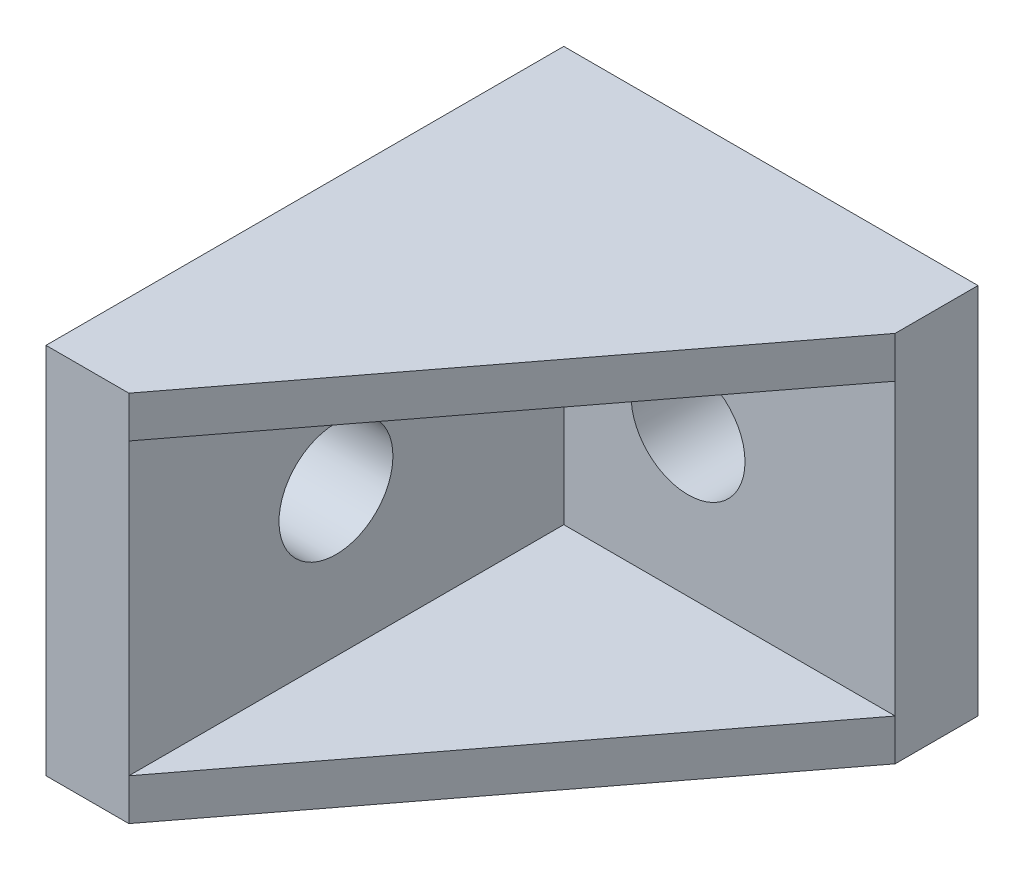
ISO-10303-21;
HEADER;
FILE_DESCRIPTION(('STEP AP214'),'2;1');
FILE_NAME('part.step','',(''),(''),'','','');
FILE_SCHEMA(('AUTOMOTIVE_DESIGN { 1 0 10303 214 1 1 1 1 }'));
ENDSEC;
DATA;
#1=APPLICATION_CONTEXT('core data for automotive mechanical design processes');
#2=APPLICATION_PROTOCOL_DEFINITION('international standard','automotive_design',2000,#1);
#3=PRODUCT_CONTEXT('',#1,'mechanical');
#4=PRODUCT('Part','Part','',(#3));
#5=PRODUCT_RELATED_PRODUCT_CATEGORY('part','',(#4));
#6=PRODUCT_DEFINITION_FORMATION('','',#4);
#7=PRODUCT_DEFINITION_CONTEXT('part definition',#1,'design');
#8=PRODUCT_DEFINITION('design','',#6,#7);
#9=PRODUCT_DEFINITION_SHAPE('','',#8);
#10=(LENGTH_UNIT() NAMED_UNIT(*) SI_UNIT(.MILLI.,.METRE.));
#11=(NAMED_UNIT(*) PLANE_ANGLE_UNIT() SI_UNIT($,.RADIAN.));
#12=(NAMED_UNIT(*) SI_UNIT($,.STERADIAN.) SOLID_ANGLE_UNIT());
#13=UNCERTAINTY_MEASURE_WITH_UNIT(LENGTH_MEASURE(1.E-05),#10,'distance_accuracy_value','');
#14=(GEOMETRIC_REPRESENTATION_CONTEXT(3) GLOBAL_UNCERTAINTY_ASSIGNED_CONTEXT((#13)) GLOBAL_UNIT_ASSIGNED_CONTEXT((#10,
#11,#12)) REPRESENTATION_CONTEXT('',''));
#15=CARTESIAN_POINT('',(0.,0.,0.));
#16=DIRECTION('',(0.,0.,1.));
#17=DIRECTION('',(1.,0.,0.));
#18=AXIS2_PLACEMENT_3D('',#15,#16,#17);
#19=CARTESIAN_POINT('',(10.,9.,25.));
#20=DIRECTION('',(-1.,0.,0.));
#21=DIRECTION('',(0.,0.,1.));
#22=AXIS2_PLACEMENT_3D('',#19,#20,#21);
#23=PLANE('',#22);
#24=DIRECTION('',(0.,0.,-1.));
#25=VECTOR('',#24,1.);
#26=CARTESIAN_POINT('',(10.,9.,25.));
#27=LINE('',#26,#25);
#28=CARTESIAN_POINT('',(10.,9.,4.));
#29=VERTEX_POINT('',#28);
#30=CARTESIAN_POINT('',(10.,9.,0.));
#31=VERTEX_POINT('',#30);
#32=EDGE_CURVE('E11',#29,#31,#27,.T.);
#33=ORIENTED_EDGE('',*,*,#32,.F.);
#34=DIRECTION('',(0.,1.,0.));
#35=VECTOR('',#34,1.);
#36=CARTESIAN_POINT('',(10.,-9.,4.));
#37=LINE('',#36,#35);
#38=CARTESIAN_POINT('',(10.,7.,4.));
#39=VERTEX_POINT('',#38);
#40=EDGE_CURVE('E139',#39,#29,#37,.T.);
#41=ORIENTED_EDGE('',*,*,#40,.F.);
#42=DIRECTION('',(0.,1.,0.));
#43=VECTOR('',#42,1.);
#44=CARTESIAN_POINT('',(10.,7.,4.));
#45=LINE('',#44,#43);
#46=CARTESIAN_POINT('',(10.,-7.,4.));
#47=VERTEX_POINT('',#46);
#48=EDGE_CURVE('E194',#47,#39,#45,.T.);
#49=ORIENTED_EDGE('',*,*,#48,.F.);
#50=CARTESIAN_POINT('',(10.,-9.,4.));
#51=VERTEX_POINT('',#50);
#52=EDGE_CURVE('E92',#51,#47,#37,.T.);
#53=ORIENTED_EDGE('',*,*,#52,.F.);
#54=DIRECTION('',(0.,0.,-1.));
#55=VECTOR('',#54,1.);
#56=CARTESIAN_POINT('',(10.,-9.,25.));
#57=LINE('',#56,#55);
#58=CARTESIAN_POINT('',(10.,-9.,0.));
#59=VERTEX_POINT('',#58);
#60=EDGE_CURVE('E84',#51,#59,#57,.T.);
#61=ORIENTED_EDGE('',*,*,#60,.T.);
#62=DIRECTION('',(0.,1.,0.));
#63=VECTOR('',#62,1.);
#64=CARTESIAN_POINT('',(10.,9.,0.));
#65=LINE('',#64,#63);
#66=EDGE_CURVE('E88',#59,#31,#65,.T.);
#67=ORIENTED_EDGE('',*,*,#66,.T.);
#68=EDGE_LOOP('',(#33,#41,#49,#53,#61,#67));
#69=FACE_BOUND('',#68,.T.);
#70=ADVANCED_FACE('F45',(#69),#23,.F.);
#71=CARTESIAN_POINT('',(-10.,9.,25.));
#72=DIRECTION('',(0.,-1.,0.));
#73=DIRECTION('',(0.,0.,-1.));
#74=AXIS2_PLACEMENT_3D('',#71,#72,#73);
#75=PLANE('',#74);
#76=DIRECTION('',(-1.,0.,0.));
#77=VECTOR('',#76,1.);
#78=CARTESIAN_POINT('',(-10.,9.,25.));
#79=LINE('',#78,#77);
#80=CARTESIAN_POINT('',(-6.,9.,25.));
#81=VERTEX_POINT('',#80);
#82=CARTESIAN_POINT('',(-10.,9.,25.));
#83=VERTEX_POINT('',#82);
#84=EDGE_CURVE('E105',#81,#83,#79,.T.);
#85=ORIENTED_EDGE('',*,*,#84,.F.);
#86=DIRECTION('',(-0.606043215262856,0.,0.795431720032499));
#87=VECTOR('',#86,1.);
#88=CARTESIAN_POINT('',(-6.,9.,25.));
#89=LINE('',#88,#87);
#90=EDGE_CURVE('E135',#29,#81,#89,.T.);
#91=ORIENTED_EDGE('',*,*,#90,.F.);
#92=ORIENTED_EDGE('',*,*,#32,.T.);
#93=DIRECTION('',(-1.,0.,0.));
#94=VECTOR('',#93,1.);
#95=CARTESIAN_POINT('',(-10.,9.,0.));
#96=LINE('',#95,#94);
#97=CARTESIAN_POINT('',(-10.,9.,0.));
#98=VERTEX_POINT('',#97);
#99=EDGE_CURVE('E109',#31,#98,#96,.T.);
#100=ORIENTED_EDGE('',*,*,#99,.T.);
#101=DIRECTION('',(0.,0.,-1.));
#102=VECTOR('',#101,1.);
#103=CARTESIAN_POINT('',(-10.,9.,25.));
#104=LINE('',#103,#102);
#105=EDGE_CURVE('E54',#83,#98,#104,.T.);
#106=ORIENTED_EDGE('',*,*,#105,.F.);
#107=EDGE_LOOP('',(#85,#91,#92,#100,#106));
#108=FACE_BOUND('',#107,.T.);
#109=ADVANCED_FACE('F130',(#108),#75,.F.);
#110=CARTESIAN_POINT('',(-10.,9.,25.));
#111=DIRECTION('',(1.,0.,0.));
#112=DIRECTION('',(0.,0.,-1.));
#113=AXIS2_PLACEMENT_3D('',#110,#111,#112);
#114=PLANE('',#113);
#115=CARTESIAN_POINT('',(-10.,0.,15.));
#116=DIRECTION('',(1.,0.,0.));
#117=DIRECTION('',(0.,1.,0.));
#118=AXIS2_PLACEMENT_3D('',#115,#116,#117);
#119=CIRCLE('',#118,2.75);
#120=CARTESIAN_POINT('',(-10.,2.75,15.));
#121=VERTEX_POINT('',#120);
#122=EDGE_CURVE('E273',#121,#121,#119,.T.);
#123=ORIENTED_EDGE('',*,*,#122,.T.);
#124=EDGE_LOOP('',(#123));
#125=FACE_BOUND('',#124,.T.);
#126=DIRECTION('',(0.,-1.,0.));
#127=VECTOR('',#126,1.);
#128=CARTESIAN_POINT('',(-10.,9.,0.));
#129=LINE('',#128,#127);
#130=CARTESIAN_POINT('',(-10.,-9.,0.));
#131=VERTEX_POINT('',#130);
#132=EDGE_CURVE('E77',#98,#131,#129,.T.);
#133=ORIENTED_EDGE('',*,*,#132,.T.);
#134=DIRECTION('',(0.,0.,-1.));
#135=VECTOR('',#134,1.);
#136=CARTESIAN_POINT('',(-10.,-9.,25.));
#137=LINE('',#136,#135);
#138=CARTESIAN_POINT('',(-10.,-9.,25.));
#139=VERTEX_POINT('',#138);
#140=EDGE_CURVE('E96',#139,#131,#137,.T.);
#141=ORIENTED_EDGE('',*,*,#140,.F.);
#142=DIRECTION('',(0.,-1.,0.));
#143=VECTOR('',#142,1.);
#144=CARTESIAN_POINT('',(-10.,9.,25.));
#145=LINE('',#144,#143);
#146=EDGE_CURVE('E62',#83,#139,#145,.T.);
#147=ORIENTED_EDGE('',*,*,#146,.F.);
#148=ORIENTED_EDGE('',*,*,#105,.T.);
#149=EDGE_LOOP('',(#133,#141,#147,#148));
#150=FACE_BOUND('',#149,.T.);
#151=ADVANCED_FACE('F127',(#125,#150),#114,.F.);
#152=CARTESIAN_POINT('',(-10.,-9.,25.));
#153=DIRECTION('',(0.,1.,0.));
#154=DIRECTION('',(0.,0.,1.));
#155=AXIS2_PLACEMENT_3D('',#152,#153,#154);
#156=PLANE('',#155);
#157=ORIENTED_EDGE('',*,*,#60,.F.);
#158=DIRECTION('',(-0.606043215262856,0.,0.795431720032499));
#159=VECTOR('',#158,1.);
#160=CARTESIAN_POINT('',(-6.,-9.,25.));
#161=LINE('',#160,#159);
#162=CARTESIAN_POINT('',(-6.,-9.,25.));
#163=VERTEX_POINT('',#162);
#164=EDGE_CURVE('E207',#51,#163,#161,.T.);
#165=ORIENTED_EDGE('',*,*,#164,.T.);
#166=DIRECTION('',(1.,0.,0.));
#167=VECTOR('',#166,1.);
#168=CARTESIAN_POINT('',(-10.,-9.,25.));
#169=LINE('',#168,#167);
#170=EDGE_CURVE('E97',#139,#163,#169,.T.);
#171=ORIENTED_EDGE('',*,*,#170,.F.);
#172=ORIENTED_EDGE('',*,*,#140,.T.);
#173=DIRECTION('',(1.,0.,0.));
#174=VECTOR('',#173,1.);
#175=CARTESIAN_POINT('',(-10.,-9.,0.));
#176=LINE('',#175,#174);
#177=EDGE_CURVE('E100',#131,#59,#176,.T.);
#178=ORIENTED_EDGE('',*,*,#177,.T.);
#179=EDGE_LOOP('',(#157,#165,#171,#172,#178));
#180=FACE_BOUND('',#179,.T.);
#181=ADVANCED_FACE('F101',(#180),#156,.F.);
#182=CARTESIAN_POINT('',(0.,0.,25.));
#183=DIRECTION('',(0.,0.,1.));
#184=DIRECTION('',(1.,0.,0.));
#185=AXIS2_PLACEMENT_3D('',#182,#183,#184);
#186=PLANE('',#185);
#187=DIRECTION('',(0.,1.,0.));
#188=VECTOR('',#187,1.);
#189=CARTESIAN_POINT('',(-6.,-9.,25.));
#190=LINE('',#189,#188);
#191=CARTESIAN_POINT('',(-6.,7.,25.));
#192=VERTEX_POINT('',#191);
#193=EDGE_CURVE('E164',#192,#81,#190,.T.);
#194=ORIENTED_EDGE('',*,*,#193,.T.);
#195=ORIENTED_EDGE('',*,*,#84,.T.);
#196=ORIENTED_EDGE('',*,*,#146,.T.);
#197=ORIENTED_EDGE('',*,*,#170,.T.);
#198=CARTESIAN_POINT('',(-6.,-7.,25.));
#199=VERTEX_POINT('',#198);
#200=EDGE_CURVE('E170',#163,#199,#190,.T.);
#201=ORIENTED_EDGE('',*,*,#200,.T.);
#202=DIRECTION('',(0.,-1.,0.));
#203=VECTOR('',#202,1.);
#204=CARTESIAN_POINT('',(-6.,7.,25.));
#205=LINE('',#204,#203);
#206=EDGE_CURVE('E185',#192,#199,#205,.T.);
#207=ORIENTED_EDGE('',*,*,#206,.F.);
#208=EDGE_LOOP('',(#194,#195,#196,#197,#201,#207));
#209=FACE_BOUND('',#208,.T.);
#210=ADVANCED_FACE('F192',(#209),#186,.T.);
#211=CARTESIAN_POINT('',(0.,0.,0.));
#212=DIRECTION('',(0.,0.,1.));
#213=DIRECTION('',(1.,0.,0.));
#214=AXIS2_PLACEMENT_3D('',#211,#212,#213);
#215=PLANE('',#214);
#216=CARTESIAN_POINT('',(0.,0.,0.));
#217=DIRECTION('',(0.,0.,1.));
#218=DIRECTION('',(1.,0.,0.));
#219=AXIS2_PLACEMENT_3D('',#216,#217,#218);
#220=CIRCLE('',#219,2.75);
#221=CARTESIAN_POINT('',(2.75,0.,0.));
#222=VERTEX_POINT('',#221);
#223=EDGE_CURVE('E214',#222,#222,#220,.T.);
#224=ORIENTED_EDGE('',*,*,#223,.T.);
#225=EDGE_LOOP('',(#224));
#226=FACE_BOUND('',#225,.T.);
#227=ORIENTED_EDGE('',*,*,#66,.F.);
#228=ORIENTED_EDGE('',*,*,#177,.F.);
#229=ORIENTED_EDGE('',*,*,#132,.F.);
#230=ORIENTED_EDGE('',*,*,#99,.F.);
#231=EDGE_LOOP('',(#227,#228,#229,#230));
#232=FACE_BOUND('',#231,.T.);
#233=ADVANCED_FACE('F108',(#226,#232),#215,.F.);
#234=CARTESIAN_POINT('',(10.,-7.,4.));
#235=DIRECTION('',(0.,-1.,0.));
#236=DIRECTION('',(1.,0.,0.));
#237=AXIS2_PLACEMENT_3D('',#234,#235,#236);
#238=PLANE('',#237);
#239=DIRECTION('',(0.,0.,1.));
#240=VECTOR('',#239,1.);
#241=CARTESIAN_POINT('',(-6.,-7.,4.));
#242=LINE('',#241,#240);
#243=CARTESIAN_POINT('',(-6.,-7.,4.));
#244=VERTEX_POINT('',#243);
#245=EDGE_CURVE('E111',#244,#199,#242,.T.);
#246=ORIENTED_EDGE('',*,*,#245,.T.);
#247=DIRECTION('',(0.606043215262856,0.,-0.795431720032499));
#248=VECTOR('',#247,1.);
#249=CARTESIAN_POINT('',(10.,-7.,4.));
#250=LINE('',#249,#248);
#251=EDGE_CURVE('E180',#199,#47,#250,.T.);
#252=ORIENTED_EDGE('',*,*,#251,.T.);
#253=DIRECTION('',(1.,0.,0.));
#254=VECTOR('',#253,1.);
#255=CARTESIAN_POINT('',(10.,-7.,4.));
#256=LINE('',#255,#254);
#257=EDGE_CURVE('E189',#244,#47,#256,.T.);
#258=ORIENTED_EDGE('',*,*,#257,.F.);
#259=EDGE_LOOP('',(#246,#252,#258));
#260=FACE_BOUND('',#259,.T.);
#261=ADVANCED_FACE('F228',(#260),#238,.F.);
#262=CARTESIAN_POINT('',(-6.,7.,4.));
#263=DIRECTION('',(-1.,0.,0.));
#264=DIRECTION('',(0.,-1.,0.));
#265=AXIS2_PLACEMENT_3D('',#262,#263,#264);
#266=PLANE('',#265);
#267=CARTESIAN_POINT('',(-6.,0.,15.));
#268=DIRECTION('',(1.,0.,0.));
#269=DIRECTION('',(0.,1.,0.));
#270=AXIS2_PLACEMENT_3D('',#267,#268,#269);
#271=CIRCLE('',#270,2.75);
#272=CARTESIAN_POINT('',(-6.,2.75,15.));
#273=VERTEX_POINT('',#272);
#274=EDGE_CURVE('E279',#273,#273,#271,.T.);
#275=ORIENTED_EDGE('',*,*,#274,.F.);
#276=EDGE_LOOP('',(#275));
#277=FACE_BOUND('',#276,.T.);
#278=ORIENTED_EDGE('',*,*,#206,.T.);
#279=ORIENTED_EDGE('',*,*,#245,.F.);
#280=DIRECTION('',(0.,-1.,0.));
#281=VECTOR('',#280,1.);
#282=CARTESIAN_POINT('',(-6.,7.,4.));
#283=LINE('',#282,#281);
#284=CARTESIAN_POINT('',(-6.,7.,4.));
#285=VERTEX_POINT('',#284);
#286=EDGE_CURVE('E187',#285,#244,#283,.T.);
#287=ORIENTED_EDGE('',*,*,#286,.F.);
#288=DIRECTION('',(0.,0.,1.));
#289=VECTOR('',#288,1.);
#290=CARTESIAN_POINT('',(-6.,7.,4.));
#291=LINE('',#290,#289);
#292=EDGE_CURVE('E117',#285,#192,#291,.T.);
#293=ORIENTED_EDGE('',*,*,#292,.T.);
#294=EDGE_LOOP('',(#278,#279,#287,#293));
#295=FACE_BOUND('',#294,.T.);
#296=ADVANCED_FACE('F184',(#277,#295),#266,.F.);
#297=CARTESIAN_POINT('',(10.,7.,4.));
#298=DIRECTION('',(0.,1.,0.));
#299=DIRECTION('',(-1.,0.,0.));
#300=AXIS2_PLACEMENT_3D('',#297,#298,#299);
#301=PLANE('',#300);
#302=DIRECTION('',(-1.,0.,0.));
#303=VECTOR('',#302,1.);
#304=CARTESIAN_POINT('',(10.,7.,4.));
#305=LINE('',#304,#303);
#306=EDGE_CURVE('E177',#39,#285,#305,.T.);
#307=ORIENTED_EDGE('',*,*,#306,.F.);
#308=DIRECTION('',(-0.606043215262856,0.,0.795431720032499));
#309=VECTOR('',#308,1.);
#310=CARTESIAN_POINT('',(10.,7.,4.));
#311=LINE('',#310,#309);
#312=EDGE_CURVE('E167',#39,#192,#311,.T.);
#313=ORIENTED_EDGE('',*,*,#312,.T.);
#314=ORIENTED_EDGE('',*,*,#292,.F.);
#315=EDGE_LOOP('',(#307,#313,#314));
#316=FACE_BOUND('',#315,.T.);
#317=ADVANCED_FACE('F174',(#316),#301,.F.);
#318=CARTESIAN_POINT('',(0.,0.,4.));
#319=DIRECTION('',(0.,0.,-1.));
#320=DIRECTION('',(-1.,0.,0.));
#321=AXIS2_PLACEMENT_3D('',#318,#319,#320);
#322=PLANE('',#321);
#323=CARTESIAN_POINT('',(0.,0.,4.));
#324=DIRECTION('',(0.,0.,1.));
#325=DIRECTION('',(1.,0.,0.));
#326=AXIS2_PLACEMENT_3D('',#323,#324,#325);
#327=CIRCLE('',#326,2.75);
#328=CARTESIAN_POINT('',(2.75,0.,4.));
#329=VERTEX_POINT('',#328);
#330=EDGE_CURVE('E270',#329,#329,#327,.T.);
#331=ORIENTED_EDGE('',*,*,#330,.F.);
#332=EDGE_LOOP('',(#331));
#333=FACE_BOUND('',#332,.T.);
#334=ORIENTED_EDGE('',*,*,#48,.T.);
#335=ORIENTED_EDGE('',*,*,#306,.T.);
#336=ORIENTED_EDGE('',*,*,#286,.T.);
#337=ORIENTED_EDGE('',*,*,#257,.T.);
#338=EDGE_LOOP('',(#334,#335,#336,#337));
#339=FACE_BOUND('',#338,.T.);
#340=ADVANCED_FACE('F226',(#333,#339),#322,.F.);
#341=CARTESIAN_POINT('',(-6.,-9.,25.));
#342=DIRECTION('',(-0.795431720032499,0.,-0.606043215262856));
#343=DIRECTION('',(-0.606043215262856,0.,0.795431720032499));
#344=AXIS2_PLACEMENT_3D('',#341,#342,#343);
#345=PLANE('',#344);
#346=ORIENTED_EDGE('',*,*,#40,.T.);
#347=ORIENTED_EDGE('',*,*,#90,.T.);
#348=ORIENTED_EDGE('',*,*,#193,.F.);
#349=ORIENTED_EDGE('',*,*,#312,.F.);
#350=EDGE_LOOP('',(#346,#347,#348,#349));
#351=FACE_BOUND('',#350,.T.);
#352=ADVANCED_FACE('F166',(#351),#345,.F.);
#353=ORIENTED_EDGE('',*,*,#200,.F.);
#354=ORIENTED_EDGE('',*,*,#164,.F.);
#355=ORIENTED_EDGE('',*,*,#52,.T.);
#356=ORIENTED_EDGE('',*,*,#251,.F.);
#357=EDGE_LOOP('',(#353,#354,#355,#356));
#358=FACE_BOUND('',#357,.T.);
#359=ADVANCED_FACE('F229',(#358),#345,.F.);
#360=CARTESIAN_POINT('',(0.,0.,0.));
#361=DIRECTION('',(0.,0.,1.));
#362=DIRECTION('',(1.,0.,0.));
#363=AXIS2_PLACEMENT_3D('',#360,#361,#362);
#364=CYLINDRICAL_SURFACE('',#363,2.75);
#365=ORIENTED_EDGE('',*,*,#223,.F.);
#366=EDGE_LOOP('',(#365));
#367=FACE_BOUND('',#366,.T.);
#368=ORIENTED_EDGE('',*,*,#330,.T.);
#369=EDGE_LOOP('',(#368));
#370=FACE_BOUND('',#369,.T.);
#371=ADVANCED_FACE('F231',(#367,#370),#364,.F.);
#372=CARTESIAN_POINT('',(-10.,0.,15.));
#373=DIRECTION('',(1.,0.,0.));
#374=DIRECTION('',(0.,1.,0.));
#375=AXIS2_PLACEMENT_3D('',#372,#373,#374);
#376=CYLINDRICAL_SURFACE('',#375,2.75);
#377=ORIENTED_EDGE('',*,*,#122,.F.);
#378=EDGE_LOOP('',(#377));
#379=FACE_BOUND('',#378,.T.);
#380=ORIENTED_EDGE('',*,*,#274,.T.);
#381=EDGE_LOOP('',(#380));
#382=FACE_BOUND('',#381,.T.);
#383=ADVANCED_FACE('F237',(#379,#382),#376,.F.);
#384=CLOSED_SHELL('',(#70,#109,#151,#181,#210,#233,#261,#296,#317,#340,#352,#359,#371,#383));
#385=MANIFOLD_SOLID_BREP('B2',#384);
#386=ADVANCED_BREP_SHAPE_REPRESENTATION('',(#18,#385),#14);
#387=SHAPE_DEFINITION_REPRESENTATION(#9,#386);
ENDSEC;
END-ISO-10303-21;
